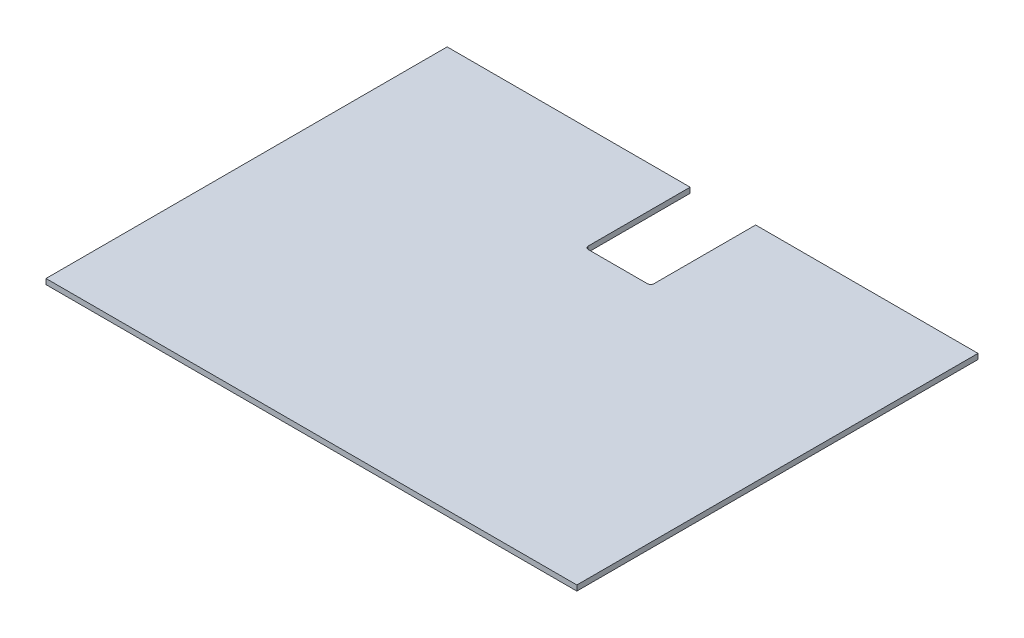
ISO-10303-21;
HEADER;
FILE_DESCRIPTION(('STEP AP214'),'2;1');
FILE_NAME('part.step','',(''),(''),'','','');
FILE_SCHEMA(('AUTOMOTIVE_DESIGN { 1 0 10303 214 1 1 1 1 }'));
ENDSEC;
DATA;
#1=APPLICATION_CONTEXT('core data for automotive mechanical design processes');
#2=APPLICATION_PROTOCOL_DEFINITION('international standard','automotive_design',2000,#1);
#3=PRODUCT_CONTEXT('',#1,'mechanical');
#4=PRODUCT('Part','Part','',(#3));
#5=PRODUCT_RELATED_PRODUCT_CATEGORY('part','',(#4));
#6=PRODUCT_DEFINITION_FORMATION('','',#4);
#7=PRODUCT_DEFINITION_CONTEXT('part definition',#1,'design');
#8=PRODUCT_DEFINITION('design','',#6,#7);
#9=PRODUCT_DEFINITION_SHAPE('','',#8);
#10=(LENGTH_UNIT() NAMED_UNIT(*) SI_UNIT(.MILLI.,.METRE.));
#11=(NAMED_UNIT(*) PLANE_ANGLE_UNIT() SI_UNIT($,.RADIAN.));
#12=(NAMED_UNIT(*) SI_UNIT($,.STERADIAN.) SOLID_ANGLE_UNIT());
#13=UNCERTAINTY_MEASURE_WITH_UNIT(LENGTH_MEASURE(1.E-05),#10,'distance_accuracy_value','');
#14=(GEOMETRIC_REPRESENTATION_CONTEXT(3) GLOBAL_UNCERTAINTY_ASSIGNED_CONTEXT((#13)) GLOBAL_UNIT_ASSIGNED_CONTEXT((#10,
#11,#12)) REPRESENTATION_CONTEXT('',''));
#15=CARTESIAN_POINT('',(0.,0.,0.));
#16=DIRECTION('',(0.,0.,1.));
#17=DIRECTION('',(1.,0.,0.));
#18=AXIS2_PLACEMENT_3D('',#15,#16,#17);
#19=CARTESIAN_POINT('',(0.,0.,-600.));
#20=DIRECTION('',(0.,0.,-1.));
#21=DIRECTION('',(-1.,0.,0.));
#22=AXIS2_PLACEMENT_3D('',#19,#20,#21);
#23=PLANE('',#22);
#24=DIRECTION('',(0.,-1.,0.));
#25=VECTOR('',#24,1.);
#26=CARTESIAN_POINT('',(488.999999999997,0.,-600.));
#27=LINE('',#26,#25);
#28=CARTESIAN_POINT('',(488.999999999997,24.0000000000002,-600.));
#29=VERTEX_POINT('',#28);
#30=CARTESIAN_POINT('',(488.999999999997,16.0000000000001,-600.));
#31=VERTEX_POINT('',#30);
#32=EDGE_CURVE('E11',#29,#31,#27,.T.);
#33=ORIENTED_EDGE('',*,*,#32,.F.);
#34=DIRECTION('',(-1.,0.,0.));
#35=VECTOR('',#34,1.);
#36=CARTESIAN_POINT('',(27.5504237359596,24.0000000000001,-600.));
#37=LINE('',#36,#35);
#38=CARTESIAN_POINT('',(821.55042373596,24.0000000000002,-600.));
#39=VERTEX_POINT('',#38);
#40=EDGE_CURVE('E142',#39,#29,#37,.T.);
#41=ORIENTED_EDGE('',*,*,#40,.F.);
#42=DIRECTION('',(0.,1.,0.));
#43=VECTOR('',#42,1.);
#44=CARTESIAN_POINT('',(821.55042373596,16.0000000000002,-600.));
#45=LINE('',#44,#43);
#46=CARTESIAN_POINT('',(821.55042373596,16.0000000000002,-600.));
#47=VERTEX_POINT('',#46);
#48=EDGE_CURVE('E173',#47,#39,#45,.T.);
#49=ORIENTED_EDGE('',*,*,#48,.F.);
#50=DIRECTION('',(1.,0.,0.));
#51=VECTOR('',#50,1.);
#52=CARTESIAN_POINT('',(27.5504237359596,16.0000000000001,-600.));
#53=LINE('',#52,#51);
#54=EDGE_CURVE('E169',#31,#47,#53,.T.);
#55=ORIENTED_EDGE('',*,*,#54,.F.);
#56=EDGE_LOOP('',(#33,#41,#49,#55));
#57=FACE_BOUND('',#56,.T.);
#58=ADVANCED_FACE('F34',(#57),#23,.T.);
#59=CARTESIAN_POINT('',(27.5504237359596,16.0000000000001,-600.));
#60=DIRECTION('',(-1.,0.,0.));
#61=DIRECTION('',(0.,0.,1.));
#62=AXIS2_PLACEMENT_3D('',#59,#60,#61);
#63=PLANE('',#62);
#64=DIRECTION('',(0.,-1.,0.));
#65=VECTOR('',#64,1.);
#66=CARTESIAN_POINT('',(27.5504237359596,16.0000000000001,0.));
#67=LINE('',#66,#65);
#68=CARTESIAN_POINT('',(27.5504237359596,24.0000000000001,0.));
#69=VERTEX_POINT('',#68);
#70=CARTESIAN_POINT('',(27.5504237359596,16.0000000000001,0.));
#71=VERTEX_POINT('',#70);
#72=EDGE_CURVE('E162',#69,#71,#67,.T.);
#73=ORIENTED_EDGE('',*,*,#72,.F.);
#74=DIRECTION('',(0.,0.,1.));
#75=VECTOR('',#74,1.);
#76=CARTESIAN_POINT('',(27.5504237359596,24.0000000000001,-600.));
#77=LINE('',#76,#75);
#78=CARTESIAN_POINT('',(27.5504237359596,24.0000000000001,-600.));
#79=VERTEX_POINT('',#78);
#80=EDGE_CURVE('E77',#79,#69,#77,.T.);
#81=ORIENTED_EDGE('',*,*,#80,.F.);
#82=DIRECTION('',(0.,-1.,0.));
#83=VECTOR('',#82,1.);
#84=CARTESIAN_POINT('',(27.5504237359596,16.0000000000001,-600.));
#85=LINE('',#84,#83);
#86=CARTESIAN_POINT('',(27.5504237359596,16.0000000000001,-600.));
#87=VERTEX_POINT('',#86);
#88=EDGE_CURVE('E166',#79,#87,#85,.T.);
#89=ORIENTED_EDGE('',*,*,#88,.T.);
#90=DIRECTION('',(0.,0.,1.));
#91=VECTOR('',#90,1.);
#92=CARTESIAN_POINT('',(27.5504237359596,16.0000000000001,-600.));
#93=LINE('',#92,#91);
#94=EDGE_CURVE('E84',#87,#71,#93,.T.);
#95=ORIENTED_EDGE('',*,*,#94,.T.);
#96=EDGE_LOOP('',(#73,#81,#89,#95));
#97=FACE_BOUND('',#96,.T.);
#98=ADVANCED_FACE('F36',(#97),#63,.T.);
#99=CARTESIAN_POINT('',(27.5504237359596,24.0000000000001,-600.));
#100=DIRECTION('',(0.,1.,0.));
#101=DIRECTION('',(-1.,0.,0.));
#102=AXIS2_PLACEMENT_3D('',#99,#100,#101);
#103=PLANE('',#102);
#104=DIRECTION('',(0.,0.,1.));
#105=VECTOR('',#104,1.);
#106=CARTESIAN_POINT('',(488.999999999997,24.0000000000002,-448.));
#107=LINE('',#106,#105);
#108=CARTESIAN_POINT('',(488.999999999997,24.0000000000002,-448.));
#109=VERTEX_POINT('',#108);
#110=EDGE_CURVE('E122',#29,#109,#107,.T.);
#111=ORIENTED_EDGE('',*,*,#110,.T.);
#112=CARTESIAN_POINT('',(483.999999999997,24.0000000000002,-448.));
#113=DIRECTION('',(0.,-1.,0.));
#114=DIRECTION('',(-1.,0.,0.));
#115=AXIS2_PLACEMENT_3D('',#112,#113,#114);
#116=CIRCLE('',#115,5.);
#117=CARTESIAN_POINT('',(483.999999999997,24.0000000000002,-443.));
#118=VERTEX_POINT('',#117);
#119=EDGE_CURVE('E133',#109,#118,#116,.T.);
#120=ORIENTED_EDGE('',*,*,#119,.T.);
#121=DIRECTION('',(-1.,0.,0.));
#122=VECTOR('',#121,1.);
#123=CARTESIAN_POINT('',(396.000000000004,24.0000000000002,-443.));
#124=LINE('',#123,#122);
#125=CARTESIAN_POINT('',(396.000000000004,24.0000000000002,-443.));
#126=VERTEX_POINT('',#125);
#127=EDGE_CURVE('E137',#118,#126,#124,.T.);
#128=ORIENTED_EDGE('',*,*,#127,.T.);
#129=CARTESIAN_POINT('',(396.000000000004,24.0000000000002,-448.));
#130=DIRECTION('',(0.,-1.,0.));
#131=DIRECTION('',(1.,0.,0.));
#132=AXIS2_PLACEMENT_3D('',#129,#130,#131);
#133=CIRCLE('',#132,5.);
#134=CARTESIAN_POINT('',(391.000000000004,24.0000000000002,-448.));
#135=VERTEX_POINT('',#134);
#136=EDGE_CURVE('E148',#126,#135,#133,.T.);
#137=ORIENTED_EDGE('',*,*,#136,.T.);
#138=DIRECTION('',(0.,0.,-1.));
#139=VECTOR('',#138,1.);
#140=CARTESIAN_POINT('',(391.000000000004,24.0000000000002,-448.));
#141=LINE('',#140,#139);
#142=CARTESIAN_POINT('',(391.000000000004,24.0000000000002,-600.));
#143=VERTEX_POINT('',#142);
#144=EDGE_CURVE('E130',#135,#143,#141,.T.);
#145=ORIENTED_EDGE('',*,*,#144,.T.);
#146=EDGE_CURVE('E58',#143,#79,#37,.T.);
#147=ORIENTED_EDGE('',*,*,#146,.T.);
#148=ORIENTED_EDGE('',*,*,#80,.T.);
#149=DIRECTION('',(-1.,0.,0.));
#150=VECTOR('',#149,1.);
#151=CARTESIAN_POINT('',(27.5504237359596,24.0000000000001,0.));
#152=LINE('',#151,#150);
#153=CARTESIAN_POINT('',(821.55042373596,24.0000000000002,0.));
#154=VERTEX_POINT('',#153);
#155=EDGE_CURVE('E170',#154,#69,#152,.T.);
#156=ORIENTED_EDGE('',*,*,#155,.F.);
#157=DIRECTION('',(0.,0.,1.));
#158=VECTOR('',#157,1.);
#159=CARTESIAN_POINT('',(821.55042373596,24.0000000000002,-600.));
#160=LINE('',#159,#158);
#161=EDGE_CURVE('E188',#39,#154,#160,.T.);
#162=ORIENTED_EDGE('',*,*,#161,.F.);
#163=ORIENTED_EDGE('',*,*,#40,.T.);
#164=EDGE_LOOP('',(#111,#120,#128,#137,#145,#147,#148,#156,#162,#163));
#165=FACE_BOUND('',#164,.T.);
#166=ADVANCED_FACE('F140',(#165),#103,.T.);
#167=CARTESIAN_POINT('',(821.55042373596,16.0000000000002,-600.));
#168=DIRECTION('',(1.,0.,0.));
#169=DIRECTION('',(0.,0.,-1.));
#170=AXIS2_PLACEMENT_3D('',#167,#168,#169);
#171=PLANE('',#170);
#172=DIRECTION('',(0.,1.,0.));
#173=VECTOR('',#172,1.);
#174=CARTESIAN_POINT('',(821.55042373596,16.0000000000002,0.));
#175=LINE('',#174,#173);
#176=CARTESIAN_POINT('',(821.55042373596,16.0000000000002,0.));
#177=VERTEX_POINT('',#176);
#178=EDGE_CURVE('E182',#177,#154,#175,.T.);
#179=ORIENTED_EDGE('',*,*,#178,.F.);
#180=DIRECTION('',(0.,0.,1.));
#181=VECTOR('',#180,1.);
#182=CARTESIAN_POINT('',(821.55042373596,16.0000000000002,-600.));
#183=LINE('',#182,#181);
#184=EDGE_CURVE('E190',#47,#177,#183,.T.);
#185=ORIENTED_EDGE('',*,*,#184,.F.);
#186=ORIENTED_EDGE('',*,*,#48,.T.);
#187=ORIENTED_EDGE('',*,*,#161,.T.);
#188=EDGE_LOOP('',(#179,#185,#186,#187));
#189=FACE_BOUND('',#188,.T.);
#190=ADVANCED_FACE('F205',(#189),#171,.T.);
#191=CARTESIAN_POINT('',(27.5504237359596,16.0000000000001,-600.));
#192=DIRECTION('',(0.,-1.,0.));
#193=DIRECTION('',(1.,0.,0.));
#194=AXIS2_PLACEMENT_3D('',#191,#192,#193);
#195=PLANE('',#194);
#196=DIRECTION('',(0.,0.,1.));
#197=VECTOR('',#196,1.);
#198=CARTESIAN_POINT('',(488.999999999997,16.0000000000001,-448.));
#199=LINE('',#198,#197);
#200=CARTESIAN_POINT('',(488.999999999997,16.0000000000001,-448.));
#201=VERTEX_POINT('',#200);
#202=EDGE_CURVE('E125',#31,#201,#199,.T.);
#203=ORIENTED_EDGE('',*,*,#202,.F.);
#204=ORIENTED_EDGE('',*,*,#54,.T.);
#205=ORIENTED_EDGE('',*,*,#184,.T.);
#206=DIRECTION('',(1.,0.,0.));
#207=VECTOR('',#206,1.);
#208=CARTESIAN_POINT('',(27.5504237359596,16.0000000000001,0.));
#209=LINE('',#208,#207);
#210=EDGE_CURVE('E179',#71,#177,#209,.T.);
#211=ORIENTED_EDGE('',*,*,#210,.F.);
#212=ORIENTED_EDGE('',*,*,#94,.F.);
#213=CARTESIAN_POINT('',(391.000000000004,16.0000000000001,-600.));
#214=VERTEX_POINT('',#213);
#215=EDGE_CURVE('E171',#87,#214,#53,.T.);
#216=ORIENTED_EDGE('',*,*,#215,.T.);
#217=DIRECTION('',(0.,0.,-1.));
#218=VECTOR('',#217,1.);
#219=CARTESIAN_POINT('',(391.000000000004,16.0000000000001,-448.));
#220=LINE('',#219,#218);
#221=CARTESIAN_POINT('',(391.000000000004,16.0000000000001,-448.));
#222=VERTEX_POINT('',#221);
#223=EDGE_CURVE('E49',#222,#214,#220,.T.);
#224=ORIENTED_EDGE('',*,*,#223,.F.);
#225=CARTESIAN_POINT('',(396.000000000004,16.0000000000001,-448.));
#226=DIRECTION('',(0.,-1.,0.));
#227=DIRECTION('',(1.,0.,0.));
#228=AXIS2_PLACEMENT_3D('',#225,#226,#227);
#229=CIRCLE('',#228,5.);
#230=CARTESIAN_POINT('',(396.000000000004,16.0000000000001,-443.));
#231=VERTEX_POINT('',#230);
#232=EDGE_CURVE('E144',#231,#222,#229,.T.);
#233=ORIENTED_EDGE('',*,*,#232,.F.);
#234=DIRECTION('',(-1.,0.,0.));
#235=VECTOR('',#234,1.);
#236=CARTESIAN_POINT('',(396.000000000004,16.0000000000001,-443.));
#237=LINE('',#236,#235);
#238=CARTESIAN_POINT('',(483.999999999997,16.0000000000001,-443.));
#239=VERTEX_POINT('',#238);
#240=EDGE_CURVE('E155',#239,#231,#237,.T.);
#241=ORIENTED_EDGE('',*,*,#240,.F.);
#242=CARTESIAN_POINT('',(483.999999999997,16.0000000000001,-448.));
#243=DIRECTION('',(0.,-1.,0.));
#244=DIRECTION('',(-1.,0.,0.));
#245=AXIS2_PLACEMENT_3D('',#242,#243,#244);
#246=CIRCLE('',#245,5.);
#247=EDGE_CURVE('E153',#201,#239,#246,.T.);
#248=ORIENTED_EDGE('',*,*,#247,.F.);
#249=EDGE_LOOP('',(#203,#204,#205,#211,#212,#216,#224,#233,#241,#248));
#250=FACE_BOUND('',#249,.T.);
#251=ADVANCED_FACE('F208',(#250),#195,.T.);
#252=DIRECTION('',(0.,1.,0.));
#253=VECTOR('',#252,1.);
#254=CARTESIAN_POINT('',(391.000000000004,0.,-600.));
#255=LINE('',#254,#253);
#256=EDGE_CURVE('E42',#214,#143,#255,.T.);
#257=ORIENTED_EDGE('',*,*,#256,.F.);
#258=ORIENTED_EDGE('',*,*,#215,.F.);
#259=ORIENTED_EDGE('',*,*,#88,.F.);
#260=ORIENTED_EDGE('',*,*,#146,.F.);
#261=EDGE_LOOP('',(#257,#258,#259,#260));
#262=FACE_BOUND('',#261,.T.);
#263=ADVANCED_FACE('F197',(#262),#23,.T.);
#264=CARTESIAN_POINT('',(0.,0.,0.));
#265=DIRECTION('',(0.,0.,-1.));
#266=DIRECTION('',(-1.,0.,0.));
#267=AXIS2_PLACEMENT_3D('',#264,#265,#266);
#268=PLANE('',#267);
#269=ORIENTED_EDGE('',*,*,#72,.T.);
#270=ORIENTED_EDGE('',*,*,#210,.T.);
#271=ORIENTED_EDGE('',*,*,#178,.T.);
#272=ORIENTED_EDGE('',*,*,#155,.T.);
#273=EDGE_LOOP('',(#269,#270,#271,#272));
#274=FACE_BOUND('',#273,.T.);
#275=ADVANCED_FACE('F200',(#274),#268,.F.);
#276=CARTESIAN_POINT('',(488.999999999997,24.0000000000002,-448.));
#277=DIRECTION('',(1.,0.,0.));
#278=DIRECTION('',(0.,1.,0.));
#279=AXIS2_PLACEMENT_3D('',#276,#277,#278);
#280=PLANE('',#279);
#281=ORIENTED_EDGE('',*,*,#32,.T.);
#282=ORIENTED_EDGE('',*,*,#202,.T.);
#283=DIRECTION('',(0.,-1.,0.));
#284=VECTOR('',#283,1.);
#285=CARTESIAN_POINT('',(488.999999999997,24.0000000000002,-448.));
#286=LINE('',#285,#284);
#287=EDGE_CURVE('E118',#109,#201,#286,.T.);
#288=ORIENTED_EDGE('',*,*,#287,.F.);
#289=ORIENTED_EDGE('',*,*,#110,.F.);
#290=EDGE_LOOP('',(#281,#282,#288,#289));
#291=FACE_BOUND('',#290,.T.);
#292=ADVANCED_FACE('F120',(#291),#280,.F.);
#293=CARTESIAN_POINT('',(391.000000000004,24.0000000000002,-448.));
#294=DIRECTION('',(-1.,0.,0.));
#295=DIRECTION('',(0.,-1.,0.));
#296=AXIS2_PLACEMENT_3D('',#293,#294,#295);
#297=PLANE('',#296);
#298=ORIENTED_EDGE('',*,*,#256,.T.);
#299=ORIENTED_EDGE('',*,*,#144,.F.);
#300=DIRECTION('',(0.,-1.,0.));
#301=VECTOR('',#300,1.);
#302=CARTESIAN_POINT('',(391.000000000004,24.0000000000002,-448.));
#303=LINE('',#302,#301);
#304=EDGE_CURVE('E160',#135,#222,#303,.T.);
#305=ORIENTED_EDGE('',*,*,#304,.T.);
#306=ORIENTED_EDGE('',*,*,#223,.T.);
#307=EDGE_LOOP('',(#298,#299,#305,#306));
#308=FACE_BOUND('',#307,.T.);
#309=ADVANCED_FACE('F193',(#308),#297,.F.);
#310=CARTESIAN_POINT('',(396.000000000004,24.0000000000002,-448.));
#311=DIRECTION('',(0.,-1.,0.));
#312=DIRECTION('',(1.,0.,0.));
#313=AXIS2_PLACEMENT_3D('',#310,#311,#312);
#314=CYLINDRICAL_SURFACE('',#313,5.);
#315=ORIENTED_EDGE('',*,*,#232,.T.);
#316=ORIENTED_EDGE('',*,*,#304,.F.);
#317=ORIENTED_EDGE('',*,*,#136,.F.);
#318=DIRECTION('',(0.,-1.,0.));
#319=VECTOR('',#318,1.);
#320=CARTESIAN_POINT('',(396.000000000004,24.0000000000002,-443.));
#321=LINE('',#320,#319);
#322=EDGE_CURVE('E163',#126,#231,#321,.T.);
#323=ORIENTED_EDGE('',*,*,#322,.T.);
#324=EDGE_LOOP('',(#315,#316,#317,#323));
#325=FACE_BOUND('',#324,.T.);
#326=ADVANCED_FACE('F214',(#325),#314,.F.);
#327=CARTESIAN_POINT('',(396.000000000004,24.0000000000002,-443.));
#328=DIRECTION('',(0.,0.,1.));
#329=DIRECTION('',(1.,0.,0.));
#330=AXIS2_PLACEMENT_3D('',#327,#328,#329);
#331=PLANE('',#330);
#332=ORIENTED_EDGE('',*,*,#240,.T.);
#333=ORIENTED_EDGE('',*,*,#322,.F.);
#334=ORIENTED_EDGE('',*,*,#127,.F.);
#335=DIRECTION('',(0.,-1.,0.));
#336=VECTOR('',#335,1.);
#337=CARTESIAN_POINT('',(483.999999999997,24.0000000000002,-443.));
#338=LINE('',#337,#336);
#339=EDGE_CURVE('E129',#118,#239,#338,.T.);
#340=ORIENTED_EDGE('',*,*,#339,.T.);
#341=EDGE_LOOP('',(#332,#333,#334,#340));
#342=FACE_BOUND('',#341,.T.);
#343=ADVANCED_FACE('F212',(#342),#331,.F.);
#344=CARTESIAN_POINT('',(483.999999999997,24.0000000000002,-448.));
#345=DIRECTION('',(0.,-1.,0.));
#346=DIRECTION('',(1.,0.,0.));
#347=AXIS2_PLACEMENT_3D('',#344,#345,#346);
#348=CYLINDRICAL_SURFACE('',#347,5.);
#349=ORIENTED_EDGE('',*,*,#247,.T.);
#350=ORIENTED_EDGE('',*,*,#339,.F.);
#351=ORIENTED_EDGE('',*,*,#119,.F.);
#352=ORIENTED_EDGE('',*,*,#287,.T.);
#353=EDGE_LOOP('',(#349,#350,#351,#352));
#354=FACE_BOUND('',#353,.T.);
#355=ADVANCED_FACE('F134',(#354),#348,.F.);
#356=CLOSED_SHELL('',(#58,#98,#166,#190,#251,#263,#275,#292,#309,#326,#343,#355));
#357=MANIFOLD_SOLID_BREP('B2',#356);
#358=ADVANCED_BREP_SHAPE_REPRESENTATION('',(#18,#357),#14);
#359=SHAPE_DEFINITION_REPRESENTATION(#9,#358);
ENDSEC;
END-ISO-10303-21;
